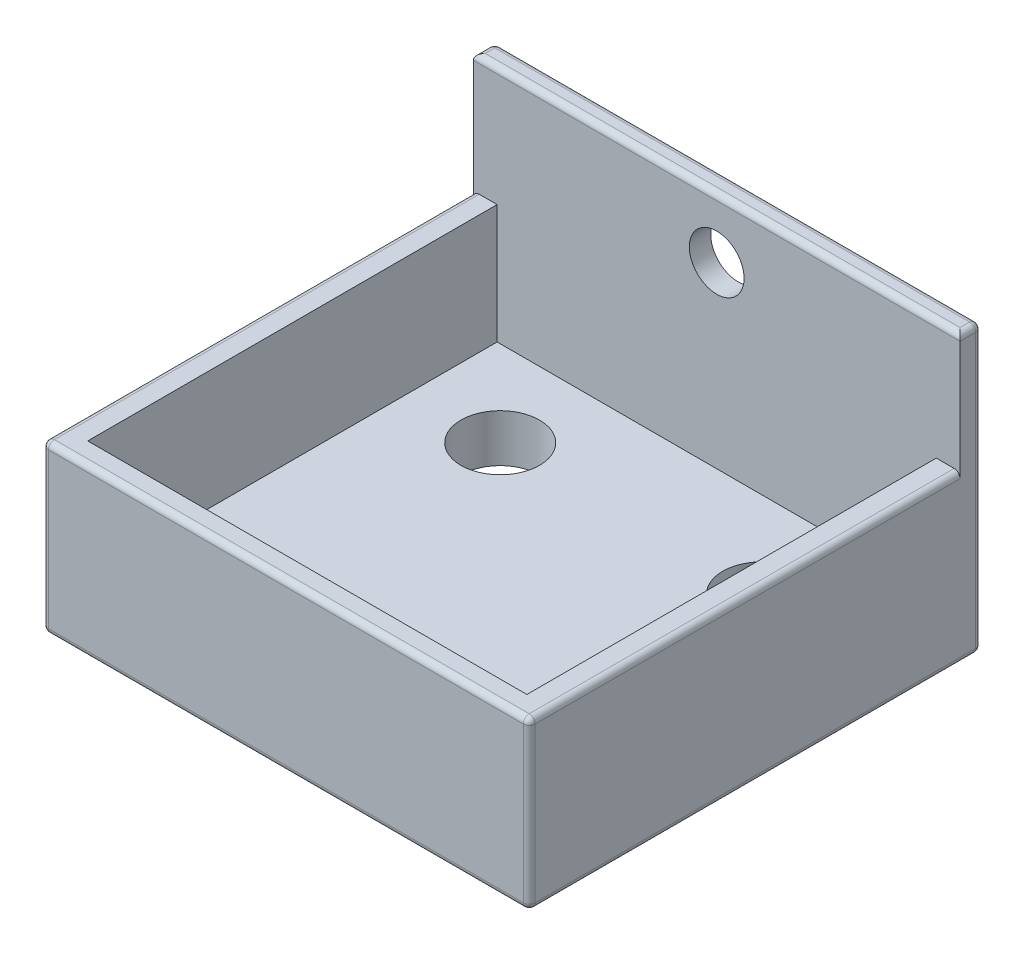
ISO-10303-21;
HEADER;
FILE_DESCRIPTION(('STEP AP214'),'2;1');
FILE_NAME('part.step','',(''),(''),'','','');
FILE_SCHEMA(('AUTOMOTIVE_DESIGN { 1 0 10303 214 1 1 1 1 }'));
ENDSEC;
DATA;
#1=APPLICATION_CONTEXT('core data for automotive mechanical design processes');
#2=APPLICATION_PROTOCOL_DEFINITION('international standard','automotive_design',2000,#1);
#3=PRODUCT_CONTEXT('',#1,'mechanical');
#4=PRODUCT('Part','Part','',(#3));
#5=PRODUCT_RELATED_PRODUCT_CATEGORY('part','',(#4));
#6=PRODUCT_DEFINITION_FORMATION('','',#4);
#7=PRODUCT_DEFINITION_CONTEXT('part definition',#1,'design');
#8=PRODUCT_DEFINITION('design','',#6,#7);
#9=PRODUCT_DEFINITION_SHAPE('','',#8);
#10=(LENGTH_UNIT() NAMED_UNIT(*) SI_UNIT(.MILLI.,.METRE.));
#11=(NAMED_UNIT(*) PLANE_ANGLE_UNIT() SI_UNIT($,.RADIAN.));
#12=(NAMED_UNIT(*) SI_UNIT($,.STERADIAN.) SOLID_ANGLE_UNIT());
#13=UNCERTAINTY_MEASURE_WITH_UNIT(LENGTH_MEASURE(1.E-05),#10,'distance_accuracy_value','');
#14=(GEOMETRIC_REPRESENTATION_CONTEXT(3) GLOBAL_UNCERTAINTY_ASSIGNED_CONTEXT((#13)) GLOBAL_UNIT_ASSIGNED_CONTEXT((#10,
#11,#12)) REPRESENTATION_CONTEXT('',''));
#15=CARTESIAN_POINT('',(0.,0.,0.));
#16=DIRECTION('',(0.,0.,1.));
#17=DIRECTION('',(1.,0.,0.));
#18=AXIS2_PLACEMENT_3D('',#15,#16,#17);
#19=CARTESIAN_POINT('',(0.,0.,0.));
#20=DIRECTION('',(0.,1.,0.));
#21=DIRECTION('',(0.,0.,1.));
#22=AXIS2_PLACEMENT_3D('',#19,#20,#21);
#23=PLANE('',#22);
#24=DIRECTION('',(0.,0.,1.));
#25=VECTOR('',#24,1.);
#26=CARTESIAN_POINT('',(-9.975,0.,0.));
#27=LINE('',#26,#25);
#28=CARTESIAN_POINT('',(-9.975,0.,9.25000000000001));
#29=VERTEX_POINT('',#28);
#30=CARTESIAN_POINT('',(-9.975,0.,-9.24999999999999));
#31=VERTEX_POINT('',#30);
#32=EDGE_CURVE('E337',#29,#31,#27,.F.);
#33=ORIENTED_EDGE('',*,*,#32,.T.);
#34=DIRECTION('',(-1.,0.,0.));
#35=VECTOR('',#34,1.);
#36=CARTESIAN_POINT('',(0.,0.,-9.24999999999999));
#37=LINE('',#36,#35);
#38=CARTESIAN_POINT('',(9.975,0.,-9.24999999999999));
#39=VERTEX_POINT('',#38);
#40=EDGE_CURVE('E339',#31,#39,#37,.F.);
#41=ORIENTED_EDGE('',*,*,#40,.T.);
#42=DIRECTION('',(0.,0.,-1.));
#43=VECTOR('',#42,1.);
#44=CARTESIAN_POINT('',(9.975,0.,0.));
#45=LINE('',#44,#43);
#46=CARTESIAN_POINT('',(9.975,0.,9.25000000000001));
#47=VERTEX_POINT('',#46);
#48=EDGE_CURVE('E333',#39,#47,#45,.F.);
#49=ORIENTED_EDGE('',*,*,#48,.T.);
#50=DIRECTION('',(1.,0.,0.));
#51=VECTOR('',#50,1.);
#52=CARTESIAN_POINT('',(0.,0.,9.25000000000001));
#53=LINE('',#52,#51);
#54=EDGE_CURVE('E335',#47,#29,#53,.F.);
#55=ORIENTED_EDGE('',*,*,#54,.T.);
#56=EDGE_LOOP('',(#33,#41,#49,#55));
#57=FACE_BOUND('',#56,.T.);
#58=CARTESIAN_POINT('',(5.505,0.,-5.));
#59=DIRECTION('',(0.,1.,0.));
#60=DIRECTION('',(0.,0.,1.));
#61=AXIS2_PLACEMENT_3D('',#58,#59,#60);
#62=CIRCLE('',#61,1.65);
#63=CARTESIAN_POINT('',(5.505,0.,-3.35));
#64=VERTEX_POINT('',#63);
#65=EDGE_CURVE('E248',#64,#64,#62,.F.);
#66=ORIENTED_EDGE('',*,*,#65,.F.);
#67=EDGE_LOOP('',(#66));
#68=FACE_BOUND('',#67,.T.);
#69=CARTESIAN_POINT('',(-5.495,0.,-5.));
#70=DIRECTION('',(0.,1.,0.));
#71=DIRECTION('',(0.,0.,1.));
#72=AXIS2_PLACEMENT_3D('',#69,#70,#71);
#73=CIRCLE('',#72,1.65);
#74=CARTESIAN_POINT('',(-5.495,0.,-3.35));
#75=VERTEX_POINT('',#74);
#76=EDGE_CURVE('E243',#75,#75,#73,.F.);
#77=ORIENTED_EDGE('',*,*,#76,.F.);
#78=EDGE_LOOP('',(#77));
#79=FACE_BOUND('',#78,.T.);
#80=DIRECTION('',(0.,0.,-1.));
#81=VECTOR('',#80,1.);
#82=CARTESIAN_POINT('',(8.,0.,4.));
#83=LINE('',#82,#81);
#84=CARTESIAN_POINT('',(8.,0.,6.));
#85=VERTEX_POINT('',#84);
#86=CARTESIAN_POINT('',(8.,0.,4.));
#87=VERTEX_POINT('',#86);
#88=EDGE_CURVE('E210',#85,#87,#83,.T.);
#89=ORIENTED_EDGE('',*,*,#88,.T.);
#90=DIRECTION('',(-1.,0.,0.));
#91=VECTOR('',#90,1.);
#92=CARTESIAN_POINT('',(-8.,0.,4.));
#93=LINE('',#92,#91);
#94=CARTESIAN_POINT('',(-8.,0.,4.));
#95=VERTEX_POINT('',#94);
#96=EDGE_CURVE('E239',#87,#95,#93,.T.);
#97=ORIENTED_EDGE('',*,*,#96,.T.);
#98=DIRECTION('',(0.,0.,-1.));
#99=VECTOR('',#98,1.);
#100=CARTESIAN_POINT('',(-8.,0.,4.));
#101=LINE('',#100,#99);
#102=CARTESIAN_POINT('',(-8.,0.,6.));
#103=VERTEX_POINT('',#102);
#104=EDGE_CURVE('E442',#103,#95,#101,.T.);
#105=ORIENTED_EDGE('',*,*,#104,.F.);
#106=DIRECTION('',(-1.,0.,0.));
#107=VECTOR('',#106,1.);
#108=CARTESIAN_POINT('',(-8.,0.,6.));
#109=LINE('',#108,#107);
#110=EDGE_CURVE('E251',#85,#103,#109,.T.);
#111=ORIENTED_EDGE('',*,*,#110,.F.);
#112=EDGE_LOOP('',(#89,#97,#105,#111));
#113=FACE_BOUND('',#112,.T.);
#114=ADVANCED_FACE('F41',(#57,#68,#79,#113),#23,.F.);
#115=CARTESIAN_POINT('',(0.,2.,0.));
#116=DIRECTION('',(0.,-1.,0.));
#117=DIRECTION('',(0.,0.,-1.));
#118=AXIS2_PLACEMENT_3D('',#115,#116,#117);
#119=PLANE('',#118);
#120=DIRECTION('',(0.,0.,-1.));
#121=VECTOR('',#120,1.);
#122=CARTESIAN_POINT('',(9.225,2.,8.6));
#123=LINE('',#122,#121);
#124=CARTESIAN_POINT('',(9.225,2.,8.6));
#125=VERTEX_POINT('',#124);
#126=CARTESIAN_POINT('',(9.225,2.,-8.6));
#127=VERTEX_POINT('',#126);
#128=EDGE_CURVE('E254',#125,#127,#123,.T.);
#129=ORIENTED_EDGE('',*,*,#128,.T.);
#130=DIRECTION('',(-1.,0.,0.));
#131=VECTOR('',#130,1.);
#132=CARTESIAN_POINT('',(-9.225,2.,-8.6));
#133=LINE('',#132,#131);
#134=CARTESIAN_POINT('',(-9.225,2.,-8.6));
#135=VERTEX_POINT('',#134);
#136=EDGE_CURVE('E257',#127,#135,#133,.T.);
#137=ORIENTED_EDGE('',*,*,#136,.T.);
#138=DIRECTION('',(0.,0.,1.));
#139=VECTOR('',#138,1.);
#140=CARTESIAN_POINT('',(-9.225,2.,8.6));
#141=LINE('',#140,#139);
#142=CARTESIAN_POINT('',(-9.225,2.,8.6));
#143=VERTEX_POINT('',#142);
#144=EDGE_CURVE('E261',#135,#143,#141,.T.);
#145=ORIENTED_EDGE('',*,*,#144,.T.);
#146=DIRECTION('',(1.,0.,0.));
#147=VECTOR('',#146,1.);
#148=CARTESIAN_POINT('',(-9.225,2.,8.6));
#149=LINE('',#148,#147);
#150=EDGE_CURVE('E264',#143,#125,#149,.T.);
#151=ORIENTED_EDGE('',*,*,#150,.T.);
#152=EDGE_LOOP('',(#129,#137,#145,#151));
#153=FACE_BOUND('',#152,.T.);
#154=CARTESIAN_POINT('',(5.505,2.,-5.));
#155=DIRECTION('',(0.,1.,0.));
#156=DIRECTION('',(0.,0.,1.));
#157=AXIS2_PLACEMENT_3D('',#154,#155,#156);
#158=CIRCLE('',#157,1.65);
#159=CARTESIAN_POINT('',(5.505,2.,-3.35));
#160=VERTEX_POINT('',#159);
#161=EDGE_CURVE('E244',#160,#160,#158,.T.);
#162=ORIENTED_EDGE('',*,*,#161,.F.);
#163=EDGE_LOOP('',(#162));
#164=FACE_BOUND('',#163,.T.);
#165=CARTESIAN_POINT('',(-5.495,2.,-5.));
#166=DIRECTION('',(0.,1.,0.));
#167=DIRECTION('',(0.,0.,1.));
#168=AXIS2_PLACEMENT_3D('',#165,#166,#167);
#169=CIRCLE('',#168,1.65);
#170=CARTESIAN_POINT('',(-5.495,2.,-3.35));
#171=VERTEX_POINT('',#170);
#172=EDGE_CURVE('E240',#171,#171,#169,.T.);
#173=ORIENTED_EDGE('',*,*,#172,.F.);
#174=EDGE_LOOP('',(#173));
#175=FACE_BOUND('',#174,.T.);
#176=DIRECTION('',(0.,0.,1.));
#177=VECTOR('',#176,1.);
#178=CARTESIAN_POINT('',(8.,2.,4.));
#179=LINE('',#178,#177);
#180=CARTESIAN_POINT('',(8.,2.,4.));
#181=VERTEX_POINT('',#180);
#182=CARTESIAN_POINT('',(8.,2.,6.));
#183=VERTEX_POINT('',#182);
#184=EDGE_CURVE('E207',#181,#183,#179,.T.);
#185=ORIENTED_EDGE('',*,*,#184,.T.);
#186=DIRECTION('',(1.,0.,0.));
#187=VECTOR('',#186,1.);
#188=CARTESIAN_POINT('',(-8.,2.,6.));
#189=LINE('',#188,#187);
#190=CARTESIAN_POINT('',(-8.,2.,6.));
#191=VERTEX_POINT('',#190);
#192=EDGE_CURVE('E218',#191,#183,#189,.T.);
#193=ORIENTED_EDGE('',*,*,#192,.F.);
#194=DIRECTION('',(0.,0.,1.));
#195=VECTOR('',#194,1.);
#196=CARTESIAN_POINT('',(-8.,2.,4.));
#197=LINE('',#196,#195);
#198=CARTESIAN_POINT('',(-8.,2.,4.));
#199=VERTEX_POINT('',#198);
#200=EDGE_CURVE('E214',#199,#191,#197,.T.);
#201=ORIENTED_EDGE('',*,*,#200,.F.);
#202=DIRECTION('',(1.,0.,0.));
#203=VECTOR('',#202,1.);
#204=CARTESIAN_POINT('',(-8.,2.,4.));
#205=LINE('',#204,#203);
#206=EDGE_CURVE('E228',#199,#181,#205,.T.);
#207=ORIENTED_EDGE('',*,*,#206,.T.);
#208=EDGE_LOOP('',(#185,#193,#201,#207));
#209=FACE_BOUND('',#208,.T.);
#210=ADVANCED_FACE('F226',(#153,#164,#175,#209),#119,.F.);
#211=CARTESIAN_POINT('',(-10.225,7.,9.50000000000001));
#212=DIRECTION('',(1.,0.,0.));
#213=DIRECTION('',(0.,0.,-1.));
#214=AXIS2_PLACEMENT_3D('',#211,#212,#213);
#215=PLANE('',#214);
#216=DIRECTION('',(0.,0.,1.));
#217=VECTOR('',#216,1.);
#218=CARTESIAN_POINT('',(-10.225,6.75,-8.59999999999999));
#219=LINE('',#218,#217);
#220=CARTESIAN_POINT('',(-10.225,6.75,9.25000000000001));
#221=VERTEX_POINT('',#220);
#222=CARTESIAN_POINT('',(-10.225,6.75,-8.59999999999999));
#223=VERTEX_POINT('',#222);
#224=EDGE_CURVE('E296',#221,#223,#219,.F.);
#225=ORIENTED_EDGE('',*,*,#224,.T.);
#226=DIRECTION('',(0.,-1.,0.));
#227=VECTOR('',#226,1.);
#228=CARTESIAN_POINT('',(-10.225,12.,-8.59999999999999));
#229=LINE('',#228,#227);
#230=CARTESIAN_POINT('',(-10.225,11.75,-8.59999999999999));
#231=VERTEX_POINT('',#230);
#232=EDGE_CURVE('E224',#231,#223,#229,.T.);
#233=ORIENTED_EDGE('',*,*,#232,.F.);
#234=DIRECTION('',(0.,0.,1.));
#235=VECTOR('',#234,1.);
#236=CARTESIAN_POINT('',(-10.225,11.75,-9.49999999999999));
#237=LINE('',#236,#235);
#238=CARTESIAN_POINT('',(-10.225,11.75,-9.24999999999999));
#239=VERTEX_POINT('',#238);
#240=EDGE_CURVE('E303',#231,#239,#237,.F.);
#241=ORIENTED_EDGE('',*,*,#240,.T.);
#242=DIRECTION('',(0.,-1.,0.));
#243=VECTOR('',#242,1.);
#244=CARTESIAN_POINT('',(-10.225,7.,-9.24999999999999));
#245=LINE('',#244,#243);
#246=CARTESIAN_POINT('',(-10.225,0.25,-9.24999999999999));
#247=VERTEX_POINT('',#246);
#248=EDGE_CURVE('E301',#239,#247,#245,.T.);
#249=ORIENTED_EDGE('',*,*,#248,.T.);
#250=DIRECTION('',(0.,0.,1.));
#251=VECTOR('',#250,1.);
#252=CARTESIAN_POINT('',(-10.225,0.25,9.50000000000001));
#253=LINE('',#252,#251);
#254=CARTESIAN_POINT('',(-10.225,0.25,9.25000000000001));
#255=VERTEX_POINT('',#254);
#256=EDGE_CURVE('E299',#247,#255,#253,.T.);
#257=ORIENTED_EDGE('',*,*,#256,.T.);
#258=DIRECTION('',(0.,-1.,0.));
#259=VECTOR('',#258,1.);
#260=CARTESIAN_POINT('',(-10.225,7.,9.25000000000001));
#261=LINE('',#260,#259);
#262=EDGE_CURVE('E294',#255,#221,#261,.F.);
#263=ORIENTED_EDGE('',*,*,#262,.T.);
#264=EDGE_LOOP('',(#225,#233,#241,#249,#257,#263));
#265=FACE_BOUND('',#264,.T.);
#266=ADVANCED_FACE('F467',(#265),#215,.F.);
#267=CARTESIAN_POINT('',(10.225,7.,9.50000000000001));
#268=DIRECTION('',(0.,0.,-1.));
#269=DIRECTION('',(-1.,0.,0.));
#270=AXIS2_PLACEMENT_3D('',#267,#268,#269);
#271=PLANE('',#270);
#272=DIRECTION('',(1.,0.,0.));
#273=VECTOR('',#272,1.);
#274=CARTESIAN_POINT('',(10.225,0.25,9.50000000000001));
#275=LINE('',#274,#273);
#276=CARTESIAN_POINT('',(-9.975,0.25,9.50000000000001));
#277=VERTEX_POINT('',#276);
#278=CARTESIAN_POINT('',(9.975,0.25,9.50000000000001));
#279=VERTEX_POINT('',#278);
#280=EDGE_CURVE('E63',#277,#279,#275,.T.);
#281=ORIENTED_EDGE('',*,*,#280,.T.);
#282=DIRECTION('',(0.,-1.,0.));
#283=VECTOR('',#282,1.);
#284=CARTESIAN_POINT('',(9.975,7.,9.50000000000001));
#285=LINE('',#284,#283);
#286=CARTESIAN_POINT('',(9.975,6.75,9.50000000000001));
#287=VERTEX_POINT('',#286);
#288=EDGE_CURVE('E58',#279,#287,#285,.F.);
#289=ORIENTED_EDGE('',*,*,#288,.T.);
#290=DIRECTION('',(1.,0.,0.));
#291=VECTOR('',#290,1.);
#292=CARTESIAN_POINT('',(-10.225,6.75,9.50000000000001));
#293=LINE('',#292,#291);
#294=CARTESIAN_POINT('',(-9.975,6.75,9.50000000000001));
#295=VERTEX_POINT('',#294);
#296=EDGE_CURVE('E345',#287,#295,#293,.F.);
#297=ORIENTED_EDGE('',*,*,#296,.T.);
#298=DIRECTION('',(0.,-1.,0.));
#299=VECTOR('',#298,1.);
#300=CARTESIAN_POINT('',(-9.975,7.,9.50000000000001));
#301=LINE('',#300,#299);
#302=EDGE_CURVE('E342',#295,#277,#301,.T.);
#303=ORIENTED_EDGE('',*,*,#302,.T.);
#304=EDGE_LOOP('',(#281,#289,#297,#303));
#305=FACE_BOUND('',#304,.T.);
#306=ADVANCED_FACE('F482',(#305),#271,.F.);
#307=CARTESIAN_POINT('',(10.225,7.,9.50000000000001));
#308=DIRECTION('',(-1.,0.,0.));
#309=DIRECTION('',(0.,0.,1.));
#310=AXIS2_PLACEMENT_3D('',#307,#308,#309);
#311=PLANE('',#310);
#312=DIRECTION('',(0.,-1.,0.));
#313=VECTOR('',#312,1.);
#314=CARTESIAN_POINT('',(10.225,7.,-9.24999999999999));
#315=LINE('',#314,#313);
#316=CARTESIAN_POINT('',(10.225,0.25,-9.24999999999999));
#317=VERTEX_POINT('',#316);
#318=CARTESIAN_POINT('',(10.225,11.75,-9.24999999999999));
#319=VERTEX_POINT('',#318);
#320=EDGE_CURVE('E312',#317,#319,#315,.F.);
#321=ORIENTED_EDGE('',*,*,#320,.T.);
#322=DIRECTION('',(0.,0.,-1.));
#323=VECTOR('',#322,1.);
#324=CARTESIAN_POINT('',(10.225,11.75,-8.59999999999999));
#325=LINE('',#324,#323);
#326=CARTESIAN_POINT('',(10.225,11.75,-8.59999999999999));
#327=VERTEX_POINT('',#326);
#328=EDGE_CURVE('E314',#319,#327,#325,.F.);
#329=ORIENTED_EDGE('',*,*,#328,.T.);
#330=DIRECTION('',(0.,-1.,0.));
#331=VECTOR('',#330,1.);
#332=CARTESIAN_POINT('',(10.225,12.,-8.59999999999999));
#333=LINE('',#332,#331);
#334=CARTESIAN_POINT('',(10.225,6.75,-8.59999999999999));
#335=VERTEX_POINT('',#334);
#336=EDGE_CURVE('E437',#327,#335,#333,.T.);
#337=ORIENTED_EDGE('',*,*,#336,.T.);
#338=DIRECTION('',(0.,0.,-1.));
#339=VECTOR('',#338,1.);
#340=CARTESIAN_POINT('',(10.225,6.75,9.50000000000001));
#341=LINE('',#340,#339);
#342=CARTESIAN_POINT('',(10.225,6.75,9.25000000000001));
#343=VERTEX_POINT('',#342);
#344=EDGE_CURVE('E310',#335,#343,#341,.F.);
#345=ORIENTED_EDGE('',*,*,#344,.T.);
#346=DIRECTION('',(0.,-1.,0.));
#347=VECTOR('',#346,1.);
#348=CARTESIAN_POINT('',(10.225,7.,9.25000000000001));
#349=LINE('',#348,#347);
#350=CARTESIAN_POINT('',(10.225,0.25,9.25000000000001));
#351=VERTEX_POINT('',#350);
#352=EDGE_CURVE('E306',#343,#351,#349,.T.);
#353=ORIENTED_EDGE('',*,*,#352,.T.);
#354=DIRECTION('',(0.,0.,-1.));
#355=VECTOR('',#354,1.);
#356=CARTESIAN_POINT('',(10.225,0.25,9.50000000000001));
#357=LINE('',#356,#355);
#358=EDGE_CURVE('E308',#351,#317,#357,.T.);
#359=ORIENTED_EDGE('',*,*,#358,.T.);
#360=EDGE_LOOP('',(#321,#329,#337,#345,#353,#359));
#361=FACE_BOUND('',#360,.T.);
#362=ADVANCED_FACE('F478',(#361),#311,.F.);
#363=CARTESIAN_POINT('',(10.225,7.,-9.49999999999999));
#364=DIRECTION('',(0.,0.,1.));
#365=DIRECTION('',(1.,0.,0.));
#366=AXIS2_PLACEMENT_3D('',#363,#364,#365);
#367=PLANE('',#366);
#368=DIRECTION('',(-1.,0.,0.));
#369=VECTOR('',#368,1.);
#370=CARTESIAN_POINT('',(10.225,0.25,-9.49999999999999));
#371=LINE('',#370,#369);
#372=CARTESIAN_POINT('',(9.975,0.25,-9.49999999999999));
#373=VERTEX_POINT('',#372);
#374=CARTESIAN_POINT('',(-9.975,0.25,-9.49999999999999));
#375=VERTEX_POINT('',#374);
#376=EDGE_CURVE('E318',#373,#375,#371,.T.);
#377=ORIENTED_EDGE('',*,*,#376,.T.);
#378=DIRECTION('',(0.,-1.,0.));
#379=VECTOR('',#378,1.);
#380=CARTESIAN_POINT('',(-9.975,7.,-9.49999999999999));
#381=LINE('',#380,#379);
#382=CARTESIAN_POINT('',(-9.975,11.75,-9.49999999999999));
#383=VERTEX_POINT('',#382);
#384=EDGE_CURVE('E323',#375,#383,#381,.F.);
#385=ORIENTED_EDGE('',*,*,#384,.T.);
#386=DIRECTION('',(-1.,0.,0.));
#387=VECTOR('',#386,1.);
#388=CARTESIAN_POINT('',(10.225,11.75,-9.49999999999999));
#389=LINE('',#388,#387);
#390=CARTESIAN_POINT('',(9.975,11.75,-9.49999999999999));
#391=VERTEX_POINT('',#390);
#392=EDGE_CURVE('E320',#383,#391,#389,.F.);
#393=ORIENTED_EDGE('',*,*,#392,.T.);
#394=DIRECTION('',(0.,-1.,0.));
#395=VECTOR('',#394,1.);
#396=CARTESIAN_POINT('',(9.975,7.,-9.49999999999999));
#397=LINE('',#396,#395);
#398=EDGE_CURVE('E316',#391,#373,#397,.T.);
#399=ORIENTED_EDGE('',*,*,#398,.T.);
#400=EDGE_LOOP('',(#377,#385,#393,#399));
#401=FACE_BOUND('',#400,.T.);
#402=CARTESIAN_POINT('',(0.,9.5,-9.49999999999999));
#403=DIRECTION('',(0.,0.,1.));
#404=DIRECTION('',(1.,0.,0.));
#405=AXIS2_PLACEMENT_3D('',#402,#403,#404);
#406=CIRCLE('',#405,1.15);
#407=CARTESIAN_POINT('',(1.15,9.5,-9.49999999999999));
#408=VERTEX_POINT('',#407);
#409=EDGE_CURVE('E428',#408,#408,#406,.F.);
#410=ORIENTED_EDGE('',*,*,#409,.F.);
#411=EDGE_LOOP('',(#410));
#412=FACE_BOUND('',#411,.T.);
#413=ADVANCED_FACE('F475',(#401,#412),#367,.F.);
#414=CARTESIAN_POINT('',(0.,7.,0.));
#415=DIRECTION('',(0.,1.,0.));
#416=DIRECTION('',(0.,0.,1.));
#417=AXIS2_PLACEMENT_3D('',#414,#415,#416);
#418=PLANE('',#417);
#419=DIRECTION('',(1.,0.,0.));
#420=VECTOR('',#419,1.);
#421=CARTESIAN_POINT('',(10.225,7.,9.25000000000001));
#422=LINE('',#421,#420);
#423=CARTESIAN_POINT('',(-9.975,7.,9.25000000000001));
#424=VERTEX_POINT('',#423);
#425=CARTESIAN_POINT('',(9.975,7.,9.25000000000001));
#426=VERTEX_POINT('',#425);
#427=EDGE_CURVE('E327',#424,#426,#422,.T.);
#428=ORIENTED_EDGE('',*,*,#427,.T.);
#429=DIRECTION('',(0.,0.,-1.));
#430=VECTOR('',#429,1.);
#431=CARTESIAN_POINT('',(9.975,7.,-8.59999999999999));
#432=LINE('',#431,#430);
#433=CARTESIAN_POINT('',(9.975,7.,-8.59999999999999));
#434=VERTEX_POINT('',#433);
#435=EDGE_CURVE('E331',#426,#434,#432,.T.);
#436=ORIENTED_EDGE('',*,*,#435,.T.);
#437=DIRECTION('',(1.,0.,0.));
#438=VECTOR('',#437,1.);
#439=CARTESIAN_POINT('',(-10.225,7.,-8.59999999999999));
#440=LINE('',#439,#438);
#441=CARTESIAN_POINT('',(9.225,7.,-8.6));
#442=VERTEX_POINT('',#441);
#443=EDGE_CURVE('E277',#442,#434,#440,.T.);
#444=ORIENTED_EDGE('',*,*,#443,.F.);
#445=DIRECTION('',(0.,0.,-1.));
#446=VECTOR('',#445,1.);
#447=CARTESIAN_POINT('',(9.225,7.,8.6));
#448=LINE('',#447,#446);
#449=CARTESIAN_POINT('',(9.225,7.,8.6));
#450=VERTEX_POINT('',#449);
#451=EDGE_CURVE('E247',#450,#442,#448,.T.);
#452=ORIENTED_EDGE('',*,*,#451,.F.);
#453=DIRECTION('',(1.,0.,0.));
#454=VECTOR('',#453,1.);
#455=CARTESIAN_POINT('',(-9.225,7.,8.6));
#456=LINE('',#455,#454);
#457=CARTESIAN_POINT('',(-9.225,7.,8.6));
#458=VERTEX_POINT('',#457);
#459=EDGE_CURVE('E258',#458,#450,#456,.T.);
#460=ORIENTED_EDGE('',*,*,#459,.F.);
#461=DIRECTION('',(0.,0.,1.));
#462=VECTOR('',#461,1.);
#463=CARTESIAN_POINT('',(-9.225,7.,8.6));
#464=LINE('',#463,#462);
#465=CARTESIAN_POINT('',(-9.225,7.,-8.6));
#466=VERTEX_POINT('',#465);
#467=EDGE_CURVE('E270',#466,#458,#464,.T.);
#468=ORIENTED_EDGE('',*,*,#467,.F.);
#469=CARTESIAN_POINT('',(-9.975,7.,-8.59999999999999));
#470=VERTEX_POINT('',#469);
#471=EDGE_CURVE('E433',#470,#466,#440,.T.);
#472=ORIENTED_EDGE('',*,*,#471,.F.);
#473=DIRECTION('',(0.,0.,1.));
#474=VECTOR('',#473,1.);
#475=CARTESIAN_POINT('',(-9.975,7.,9.50000000000001));
#476=LINE('',#475,#474);
#477=EDGE_CURVE('E329',#470,#424,#476,.T.);
#478=ORIENTED_EDGE('',*,*,#477,.T.);
#479=EDGE_LOOP('',(#428,#436,#444,#452,#460,#468,#472,#478));
#480=FACE_BOUND('',#479,.T.);
#481=ADVANCED_FACE('F473',(#480),#418,.T.);
#482=CARTESIAN_POINT('',(9.225,2.,8.6));
#483=DIRECTION('',(1.,0.,0.));
#484=DIRECTION('',(0.,0.,-1.));
#485=AXIS2_PLACEMENT_3D('',#482,#483,#484);
#486=PLANE('',#485);
#487=ORIENTED_EDGE('',*,*,#451,.T.);
#488=DIRECTION('',(0.,1.,0.));
#489=VECTOR('',#488,1.);
#490=CARTESIAN_POINT('',(9.225,2.,-8.6));
#491=LINE('',#490,#489);
#492=EDGE_CURVE('E267',#127,#442,#491,.T.);
#493=ORIENTED_EDGE('',*,*,#492,.F.);
#494=ORIENTED_EDGE('',*,*,#128,.F.);
#495=DIRECTION('',(0.,1.,0.));
#496=VECTOR('',#495,1.);
#497=CARTESIAN_POINT('',(9.225,2.,8.6));
#498=LINE('',#497,#496);
#499=EDGE_CURVE('E275',#125,#450,#498,.T.);
#500=ORIENTED_EDGE('',*,*,#499,.T.);
#501=EDGE_LOOP('',(#487,#493,#494,#500));
#502=FACE_BOUND('',#501,.T.);
#503=ADVANCED_FACE('F594',(#502),#486,.F.);
#504=CARTESIAN_POINT('',(-9.225,2.,8.6));
#505=DIRECTION('',(0.,0.,1.));
#506=DIRECTION('',(1.,0.,0.));
#507=AXIS2_PLACEMENT_3D('',#504,#505,#506);
#508=PLANE('',#507);
#509=ORIENTED_EDGE('',*,*,#459,.T.);
#510=ORIENTED_EDGE('',*,*,#499,.F.);
#511=ORIENTED_EDGE('',*,*,#150,.F.);
#512=DIRECTION('',(0.,1.,0.));
#513=VECTOR('',#512,1.);
#514=CARTESIAN_POINT('',(-9.225,2.,8.6));
#515=LINE('',#514,#513);
#516=EDGE_CURVE('E278',#143,#458,#515,.T.);
#517=ORIENTED_EDGE('',*,*,#516,.T.);
#518=EDGE_LOOP('',(#509,#510,#511,#517));
#519=FACE_BOUND('',#518,.T.);
#520=ADVANCED_FACE('F599',(#519),#508,.F.);
#521=CARTESIAN_POINT('',(-9.225,2.,8.6));
#522=DIRECTION('',(-1.,0.,0.));
#523=DIRECTION('',(0.,0.,1.));
#524=AXIS2_PLACEMENT_3D('',#521,#522,#523);
#525=PLANE('',#524);
#526=ORIENTED_EDGE('',*,*,#467,.T.);
#527=ORIENTED_EDGE('',*,*,#516,.F.);
#528=ORIENTED_EDGE('',*,*,#144,.F.);
#529=DIRECTION('',(0.,1.,0.));
#530=VECTOR('',#529,1.);
#531=CARTESIAN_POINT('',(-9.225,2.,-8.6));
#532=LINE('',#531,#530);
#533=EDGE_CURVE('E280',#135,#466,#532,.T.);
#534=ORIENTED_EDGE('',*,*,#533,.T.);
#535=EDGE_LOOP('',(#526,#527,#528,#534));
#536=FACE_BOUND('',#535,.T.);
#537=ADVANCED_FACE('F603',(#536),#525,.F.);
#538=CARTESIAN_POINT('',(-9.225,2.,-8.6));
#539=DIRECTION('',(0.,0.,-1.));
#540=DIRECTION('',(-1.,0.,0.));
#541=AXIS2_PLACEMENT_3D('',#538,#539,#540);
#542=PLANE('',#541);
#543=CARTESIAN_POINT('',(0.,9.5,-8.6));
#544=DIRECTION('',(0.,0.,1.));
#545=DIRECTION('',(1.,0.,0.));
#546=AXIS2_PLACEMENT_3D('',#543,#544,#545);
#547=CIRCLE('',#546,1.15);
#548=CARTESIAN_POINT('',(1.15,9.5,-8.6));
#549=VERTEX_POINT('',#548);
#550=EDGE_CURVE('E423',#549,#549,#547,.T.);
#551=ORIENTED_EDGE('',*,*,#550,.F.);
#552=EDGE_LOOP('',(#551));
#553=FACE_BOUND('',#552,.T.);
#554=ORIENTED_EDGE('',*,*,#336,.F.);
#555=DIRECTION('',(1.,0.,0.));
#556=VECTOR('',#555,1.);
#557=CARTESIAN_POINT('',(-10.225,11.75,-8.6));
#558=LINE('',#557,#556);
#559=EDGE_CURVE('E325',#327,#231,#558,.F.);
#560=ORIENTED_EDGE('',*,*,#559,.T.);
#561=ORIENTED_EDGE('',*,*,#232,.T.);
#562=CARTESIAN_POINT('',(-9.975,6.75,-8.6));
#563=DIRECTION('',(0.,0.,-1.));
#564=DIRECTION('',(-1.,0.,0.));
#565=AXIS2_PLACEMENT_3D('',#562,#563,#564);
#566=CIRCLE('',#565,0.25);
#567=EDGE_CURVE('E11',#223,#470,#566,.T.);
#568=ORIENTED_EDGE('',*,*,#567,.T.);
#569=ORIENTED_EDGE('',*,*,#471,.T.);
#570=ORIENTED_EDGE('',*,*,#533,.F.);
#571=ORIENTED_EDGE('',*,*,#136,.F.);
#572=ORIENTED_EDGE('',*,*,#492,.T.);
#573=ORIENTED_EDGE('',*,*,#443,.T.);
#574=CARTESIAN_POINT('',(9.975,6.75,-8.6));
#575=DIRECTION('',(0.,0.,-1.));
#576=DIRECTION('',(-1.,0.,0.));
#577=AXIS2_PLACEMENT_3D('',#574,#575,#576);
#578=CIRCLE('',#577,0.25);
#579=EDGE_CURVE('E50',#434,#335,#578,.T.);
#580=ORIENTED_EDGE('',*,*,#579,.T.);
#581=EDGE_LOOP('',(#554,#560,#561,#568,#569,#570,#571,#572,#573,#580));
#582=FACE_BOUND('',#581,.T.);
#583=ADVANCED_FACE('F590',(#553,#582),#542,.F.);
#584=CARTESIAN_POINT('',(5.505,-4.66690475583122,-5.));
#585=DIRECTION('',(0.,1.,0.));
#586=DIRECTION('',(0.,0.,1.));
#587=AXIS2_PLACEMENT_3D('',#584,#585,#586);
#588=CYLINDRICAL_SURFACE('',#587,1.65);
#589=ORIENTED_EDGE('',*,*,#65,.T.);
#590=EDGE_LOOP('',(#589));
#591=FACE_BOUND('',#590,.T.);
#592=ORIENTED_EDGE('',*,*,#161,.T.);
#593=EDGE_LOOP('',(#592));
#594=FACE_BOUND('',#593,.T.);
#595=ADVANCED_FACE('F665',(#591,#594),#588,.F.);
#596=CARTESIAN_POINT('',(-5.495,-4.66690475583122,-5.));
#597=DIRECTION('',(0.,1.,0.));
#598=DIRECTION('',(0.,0.,1.));
#599=AXIS2_PLACEMENT_3D('',#596,#597,#598);
#600=CYLINDRICAL_SURFACE('',#599,1.65);
#601=ORIENTED_EDGE('',*,*,#76,.T.);
#602=EDGE_LOOP('',(#601));
#603=FACE_BOUND('',#602,.T.);
#604=ORIENTED_EDGE('',*,*,#172,.T.);
#605=EDGE_LOOP('',(#604));
#606=FACE_BOUND('',#605,.T.);
#607=ADVANCED_FACE('F457',(#603,#606),#600,.F.);
#608=CARTESIAN_POINT('',(8.,-16.1245154965971,4.));
#609=DIRECTION('',(-1.,0.,0.));
#610=DIRECTION('',(0.,0.,1.));
#611=AXIS2_PLACEMENT_3D('',#608,#609,#610);
#612=PLANE('',#611);
#613=DIRECTION('',(0.,1.,0.));
#614=VECTOR('',#613,1.);
#615=CARTESIAN_POINT('',(8.,-16.1245154965971,6.));
#616=LINE('',#615,#614);
#617=EDGE_CURVE('E202',#85,#183,#616,.T.);
#618=ORIENTED_EDGE('',*,*,#617,.T.);
#619=ORIENTED_EDGE('',*,*,#184,.F.);
#620=DIRECTION('',(0.,1.,0.));
#621=VECTOR('',#620,1.);
#622=CARTESIAN_POINT('',(8.,-16.1245154965971,4.));
#623=LINE('',#622,#621);
#624=EDGE_CURVE('E213',#87,#181,#623,.T.);
#625=ORIENTED_EDGE('',*,*,#624,.F.);
#626=ORIENTED_EDGE('',*,*,#88,.F.);
#627=EDGE_LOOP('',(#618,#619,#625,#626));
#628=FACE_BOUND('',#627,.T.);
#629=ADVANCED_FACE('F204',(#628),#612,.T.);
#630=CARTESIAN_POINT('',(-8.,-16.1245154965971,4.));
#631=DIRECTION('',(0.,0.,1.));
#632=DIRECTION('',(1.,0.,0.));
#633=AXIS2_PLACEMENT_3D('',#630,#631,#632);
#634=PLANE('',#633);
#635=ORIENTED_EDGE('',*,*,#624,.T.);
#636=ORIENTED_EDGE('',*,*,#206,.F.);
#637=DIRECTION('',(0.,1.,0.));
#638=VECTOR('',#637,1.);
#639=CARTESIAN_POINT('',(-8.,-16.1245154965971,4.));
#640=LINE('',#639,#638);
#641=EDGE_CURVE('E235',#95,#199,#640,.T.);
#642=ORIENTED_EDGE('',*,*,#641,.F.);
#643=ORIENTED_EDGE('',*,*,#96,.F.);
#644=EDGE_LOOP('',(#635,#636,#642,#643));
#645=FACE_BOUND('',#644,.T.);
#646=ADVANCED_FACE('F449',(#645),#634,.T.);
#647=CARTESIAN_POINT('',(-8.,-16.1245154965971,4.));
#648=DIRECTION('',(-1.,0.,0.));
#649=DIRECTION('',(0.,0.,1.));
#650=AXIS2_PLACEMENT_3D('',#647,#648,#649);
#651=PLANE('',#650);
#652=ORIENTED_EDGE('',*,*,#104,.T.);
#653=ORIENTED_EDGE('',*,*,#641,.T.);
#654=ORIENTED_EDGE('',*,*,#200,.T.);
#655=DIRECTION('',(0.,1.,0.));
#656=VECTOR('',#655,1.);
#657=CARTESIAN_POINT('',(-8.,-16.1245154965971,6.));
#658=LINE('',#657,#656);
#659=EDGE_CURVE('E221',#103,#191,#658,.T.);
#660=ORIENTED_EDGE('',*,*,#659,.F.);
#661=EDGE_LOOP('',(#652,#653,#654,#660));
#662=FACE_BOUND('',#661,.T.);
#663=ADVANCED_FACE('F446',(#662),#651,.F.);
#664=CARTESIAN_POINT('',(-8.,-16.1245154965971,6.));
#665=DIRECTION('',(0.,0.,1.));
#666=DIRECTION('',(1.,0.,0.));
#667=AXIS2_PLACEMENT_3D('',#664,#665,#666);
#668=PLANE('',#667);
#669=ORIENTED_EDGE('',*,*,#110,.T.);
#670=ORIENTED_EDGE('',*,*,#659,.T.);
#671=ORIENTED_EDGE('',*,*,#192,.T.);
#672=ORIENTED_EDGE('',*,*,#617,.F.);
#673=EDGE_LOOP('',(#669,#670,#671,#672));
#674=FACE_BOUND('',#673,.T.);
#675=ADVANCED_FACE('F219',(#674),#668,.F.);
#676=CARTESIAN_POINT('',(0.,12.,0.));
#677=DIRECTION('',(0.,1.,0.));
#678=DIRECTION('',(0.,0.,1.));
#679=AXIS2_PLACEMENT_3D('',#676,#677,#678);
#680=PLANE('',#679);
#681=DIRECTION('',(0.,0.,-1.));
#682=VECTOR('',#681,1.);
#683=CARTESIAN_POINT('',(9.975,12.,-9.49999999999999));
#684=LINE('',#683,#682);
#685=CARTESIAN_POINT('',(9.975,12.,-8.85));
#686=VERTEX_POINT('',#685);
#687=CARTESIAN_POINT('',(9.975,12.,-9.24999999999999));
#688=VERTEX_POINT('',#687);
#689=EDGE_CURVE('E287',#686,#688,#684,.T.);
#690=ORIENTED_EDGE('',*,*,#689,.T.);
#691=DIRECTION('',(-1.,0.,0.));
#692=VECTOR('',#691,1.);
#693=CARTESIAN_POINT('',(-10.225,12.,-9.24999999999999));
#694=LINE('',#693,#692);
#695=CARTESIAN_POINT('',(-9.975,12.,-9.24999999999999));
#696=VERTEX_POINT('',#695);
#697=EDGE_CURVE('E292',#688,#696,#694,.T.);
#698=ORIENTED_EDGE('',*,*,#697,.T.);
#699=DIRECTION('',(0.,0.,1.));
#700=VECTOR('',#699,1.);
#701=CARTESIAN_POINT('',(-9.975,12.,-8.59999999999999));
#702=LINE('',#701,#700);
#703=CARTESIAN_POINT('',(-9.975,12.,-8.85));
#704=VERTEX_POINT('',#703);
#705=EDGE_CURVE('E289',#696,#704,#702,.T.);
#706=ORIENTED_EDGE('',*,*,#705,.T.);
#707=DIRECTION('',(1.,0.,0.));
#708=VECTOR('',#707,1.);
#709=CARTESIAN_POINT('',(10.225,12.,-8.85));
#710=LINE('',#709,#708);
#711=EDGE_CURVE('E285',#704,#686,#710,.T.);
#712=ORIENTED_EDGE('',*,*,#711,.T.);
#713=EDGE_LOOP('',(#690,#698,#706,#712));
#714=FACE_BOUND('',#713,.T.);
#715=ADVANCED_FACE('F649',(#714),#680,.T.);
#716=CARTESIAN_POINT('',(0.,9.5,-12.7526911934581));
#717=DIRECTION('',(0.,0.,1.));
#718=DIRECTION('',(1.,0.,0.));
#719=AXIS2_PLACEMENT_3D('',#716,#717,#718);
#720=CYLINDRICAL_SURFACE('',#719,1.15);
#721=ORIENTED_EDGE('',*,*,#409,.T.);
#722=EDGE_LOOP('',(#721));
#723=FACE_BOUND('',#722,.T.);
#724=ORIENTED_EDGE('',*,*,#550,.T.);
#725=EDGE_LOOP('',(#724));
#726=FACE_BOUND('',#725,.T.);
#727=ADVANCED_FACE('F575',(#723,#726),#720,.F.);
#728=CARTESIAN_POINT('',(9.975,6.75,0.));
#729=DIRECTION('',(0.,0.,1.));
#730=DIRECTION('',(1.,0.,0.));
#731=AXIS2_PLACEMENT_3D('',#728,#729,#730);
#732=CYLINDRICAL_SURFACE('',#731,0.25);
#733=CARTESIAN_POINT('',(9.975,6.75,9.25000000000001));
#734=DIRECTION('',(0.,0.,1.));
#735=DIRECTION('',(1.,0.,0.));
#736=AXIS2_PLACEMENT_3D('',#733,#734,#735);
#737=CIRCLE('',#736,0.25);
#738=EDGE_CURVE('E45',#343,#426,#737,.T.);
#739=ORIENTED_EDGE('',*,*,#738,.F.);
#740=ORIENTED_EDGE('',*,*,#344,.F.);
#741=ORIENTED_EDGE('',*,*,#579,.F.);
#742=ORIENTED_EDGE('',*,*,#435,.F.);
#743=EDGE_LOOP('',(#739,#740,#741,#742));
#744=FACE_BOUND('',#743,.T.);
#745=ADVANCED_FACE('F43',(#744),#732,.T.);
#746=CARTESIAN_POINT('',(9.975,6.75,9.25000000000001));
#747=DIRECTION('',(0.,1.,0.));
#748=DIRECTION('',(0.,0.,1.));
#749=AXIS2_PLACEMENT_3D('',#746,#747,#748);
#750=SPHERICAL_SURFACE('',#749,0.25);
#751=CARTESIAN_POINT('',(9.975,6.75,9.25000000000001));
#752=DIRECTION('',(0.,1.,0.));
#753=DIRECTION('',(0.,0.,1.));
#754=AXIS2_PLACEMENT_3D('',#751,#752,#753);
#755=CIRCLE('',#754,0.25);
#756=EDGE_CURVE('E415',#343,#287,#755,.F.);
#757=ORIENTED_EDGE('',*,*,#756,.F.);
#758=ORIENTED_EDGE('',*,*,#738,.T.);
#759=CARTESIAN_POINT('',(9.975,6.75,9.25000000000001));
#760=DIRECTION('',(1.,0.,0.));
#761=DIRECTION('',(0.,0.,-1.));
#762=AXIS2_PLACEMENT_3D('',#759,#760,#761);
#763=CIRCLE('',#762,0.25);
#764=EDGE_CURVE('E416',#287,#426,#763,.F.);
#765=ORIENTED_EDGE('',*,*,#764,.F.);
#766=EDGE_LOOP('',(#757,#758,#765));
#767=FACE_BOUND('',#766,.T.);
#768=ADVANCED_FACE('F569',(#767),#750,.T.);
#769=CARTESIAN_POINT('',(-9.975,6.75,0.));
#770=DIRECTION('',(0.,0.,-1.));
#771=DIRECTION('',(-1.,0.,0.));
#772=AXIS2_PLACEMENT_3D('',#769,#770,#771);
#773=CYLINDRICAL_SURFACE('',#772,0.25);
#774=ORIENTED_EDGE('',*,*,#567,.F.);
#775=ORIENTED_EDGE('',*,*,#224,.F.);
#776=CARTESIAN_POINT('',(-9.975,6.75,9.25000000000001));
#777=DIRECTION('',(0.,0.,1.));
#778=DIRECTION('',(1.,0.,0.));
#779=AXIS2_PLACEMENT_3D('',#776,#777,#778);
#780=CIRCLE('',#779,0.25);
#781=EDGE_CURVE('E412',#424,#221,#780,.T.);
#782=ORIENTED_EDGE('',*,*,#781,.F.);
#783=ORIENTED_EDGE('',*,*,#477,.F.);
#784=EDGE_LOOP('',(#774,#775,#782,#783));
#785=FACE_BOUND('',#784,.T.);
#786=ADVANCED_FACE('F567',(#785),#773,.T.);
#787=CARTESIAN_POINT('',(0.,6.75,9.25000000000001));
#788=DIRECTION('',(-1.,0.,0.));
#789=DIRECTION('',(0.,0.,1.));
#790=AXIS2_PLACEMENT_3D('',#787,#788,#789);
#791=CYLINDRICAL_SURFACE('',#790,0.25);
#792=ORIENTED_EDGE('',*,*,#764,.T.);
#793=ORIENTED_EDGE('',*,*,#427,.F.);
#794=CARTESIAN_POINT('',(-9.975,6.75,9.25000000000001));
#795=DIRECTION('',(-1.,0.,0.));
#796=DIRECTION('',(0.,0.,1.));
#797=AXIS2_PLACEMENT_3D('',#794,#795,#796);
#798=CIRCLE('',#797,0.25);
#799=EDGE_CURVE('E409',#295,#424,#798,.T.);
#800=ORIENTED_EDGE('',*,*,#799,.F.);
#801=ORIENTED_EDGE('',*,*,#296,.F.);
#802=EDGE_LOOP('',(#792,#793,#800,#801));
#803=FACE_BOUND('',#802,.T.);
#804=ADVANCED_FACE('F563',(#803),#791,.T.);
#805=CARTESIAN_POINT('',(9.975,7.,9.25000000000001));
#806=DIRECTION('',(0.,-1.,0.));
#807=DIRECTION('',(0.,0.,-1.));
#808=AXIS2_PLACEMENT_3D('',#805,#806,#807);
#809=CYLINDRICAL_SURFACE('',#808,0.25);
#810=ORIENTED_EDGE('',*,*,#756,.T.);
#811=ORIENTED_EDGE('',*,*,#288,.F.);
#812=CARTESIAN_POINT('',(9.975,0.25,9.25000000000001));
#813=DIRECTION('',(0.,-1.,0.));
#814=DIRECTION('',(0.,0.,-1.));
#815=AXIS2_PLACEMENT_3D('',#812,#813,#814);
#816=CIRCLE('',#815,0.25);
#817=EDGE_CURVE('E406',#351,#279,#816,.T.);
#818=ORIENTED_EDGE('',*,*,#817,.F.);
#819=ORIENTED_EDGE('',*,*,#352,.F.);
#820=EDGE_LOOP('',(#810,#811,#818,#819));
#821=FACE_BOUND('',#820,.T.);
#822=ADVANCED_FACE('F559',(#821),#809,.T.);
#823=CARTESIAN_POINT('',(-9.975,6.75,9.25000000000001));
#824=DIRECTION('',(0.,1.,0.));
#825=DIRECTION('',(0.,0.,1.));
#826=AXIS2_PLACEMENT_3D('',#823,#824,#825);
#827=SPHERICAL_SURFACE('',#826,0.25);
#828=ORIENTED_EDGE('',*,*,#799,.T.);
#829=ORIENTED_EDGE('',*,*,#781,.T.);
#830=CARTESIAN_POINT('',(-9.975,6.75,9.25000000000001));
#831=DIRECTION('',(0.,1.,0.));
#832=DIRECTION('',(0.,0.,1.));
#833=AXIS2_PLACEMENT_3D('',#830,#831,#832);
#834=CIRCLE('',#833,0.25);
#835=EDGE_CURVE('E403',#295,#221,#834,.F.);
#836=ORIENTED_EDGE('',*,*,#835,.F.);
#837=EDGE_LOOP('',(#828,#829,#836));
#838=FACE_BOUND('',#837,.T.);
#839=ADVANCED_FACE('F555',(#838),#827,.T.);
#840=CARTESIAN_POINT('',(9.975,0.25,9.25000000000001));
#841=DIRECTION('',(0.,0.,1.));
#842=DIRECTION('',(0.,-1.,0.));
#843=AXIS2_PLACEMENT_3D('',#840,#841,#842);
#844=SPHERICAL_SURFACE('',#843,0.25);
#845=CARTESIAN_POINT('',(9.975,0.25,9.25000000000001));
#846=DIRECTION('',(0.,0.,1.));
#847=DIRECTION('',(1.,0.,0.));
#848=AXIS2_PLACEMENT_3D('',#845,#846,#847);
#849=CIRCLE('',#848,0.25);
#850=EDGE_CURVE('E397',#351,#47,#849,.F.);
#851=ORIENTED_EDGE('',*,*,#850,.F.);
#852=ORIENTED_EDGE('',*,*,#817,.T.);
#853=CARTESIAN_POINT('',(9.975,0.25,9.25000000000001));
#854=DIRECTION('',(1.,0.,0.));
#855=DIRECTION('',(0.,0.,-1.));
#856=AXIS2_PLACEMENT_3D('',#853,#854,#855);
#857=CIRCLE('',#856,0.25);
#858=EDGE_CURVE('E400',#47,#279,#857,.F.);
#859=ORIENTED_EDGE('',*,*,#858,.F.);
#860=EDGE_LOOP('',(#851,#852,#859));
#861=FACE_BOUND('',#860,.T.);
#862=ADVANCED_FACE('F551',(#861),#844,.T.);
#863=CARTESIAN_POINT('',(-9.975,7.,9.25000000000001));
#864=DIRECTION('',(0.,-1.,0.));
#865=DIRECTION('',(0.,0.,-1.));
#866=AXIS2_PLACEMENT_3D('',#863,#864,#865);
#867=CYLINDRICAL_SURFACE('',#866,0.25);
#868=ORIENTED_EDGE('',*,*,#835,.T.);
#869=ORIENTED_EDGE('',*,*,#262,.F.);
#870=CARTESIAN_POINT('',(-9.975,0.25,9.25000000000001));
#871=DIRECTION('',(0.,-1.,0.));
#872=DIRECTION('',(0.,0.,-1.));
#873=AXIS2_PLACEMENT_3D('',#870,#871,#872);
#874=CIRCLE('',#873,0.25);
#875=EDGE_CURVE('E394',#277,#255,#874,.T.);
#876=ORIENTED_EDGE('',*,*,#875,.F.);
#877=ORIENTED_EDGE('',*,*,#302,.F.);
#878=EDGE_LOOP('',(#868,#869,#876,#877));
#879=FACE_BOUND('',#878,.T.);
#880=ADVANCED_FACE('F547',(#879),#867,.T.);
#881=CARTESIAN_POINT('',(10.225,0.25,9.25000000000001));
#882=DIRECTION('',(1.,0.,0.));
#883=DIRECTION('',(0.,0.,-1.));
#884=AXIS2_PLACEMENT_3D('',#881,#882,#883);
#885=CYLINDRICAL_SURFACE('',#884,0.25);
#886=ORIENTED_EDGE('',*,*,#858,.T.);
#887=ORIENTED_EDGE('',*,*,#280,.F.);
#888=CARTESIAN_POINT('',(-9.975,0.25,9.25000000000001));
#889=DIRECTION('',(-1.,0.,0.));
#890=DIRECTION('',(0.,0.,1.));
#891=AXIS2_PLACEMENT_3D('',#888,#889,#890);
#892=CIRCLE('',#891,0.25);
#893=EDGE_CURVE('E391',#29,#277,#892,.T.);
#894=ORIENTED_EDGE('',*,*,#893,.F.);
#895=ORIENTED_EDGE('',*,*,#54,.F.);
#896=EDGE_LOOP('',(#886,#887,#894,#895));
#897=FACE_BOUND('',#896,.T.);
#898=ADVANCED_FACE('F543',(#897),#885,.T.);
#899=CARTESIAN_POINT('',(9.975,0.25,9.50000000000001));
#900=DIRECTION('',(0.,0.,-1.));
#901=DIRECTION('',(-1.,0.,0.));
#902=AXIS2_PLACEMENT_3D('',#899,#900,#901);
#903=CYLINDRICAL_SURFACE('',#902,0.25);
#904=ORIENTED_EDGE('',*,*,#850,.T.);
#905=ORIENTED_EDGE('',*,*,#48,.F.);
#906=CARTESIAN_POINT('',(9.975,0.25,-9.24999999999999));
#907=DIRECTION('',(0.,0.,-1.));
#908=DIRECTION('',(-1.,0.,0.));
#909=AXIS2_PLACEMENT_3D('',#906,#907,#908);
#910=CIRCLE('',#909,0.25);
#911=EDGE_CURVE('E388',#317,#39,#910,.T.);
#912=ORIENTED_EDGE('',*,*,#911,.F.);
#913=ORIENTED_EDGE('',*,*,#358,.F.);
#914=EDGE_LOOP('',(#904,#905,#912,#913));
#915=FACE_BOUND('',#914,.T.);
#916=ADVANCED_FACE('F539',(#915),#903,.T.);
#917=CARTESIAN_POINT('',(-9.975,0.25,9.25000000000001));
#918=DIRECTION('',(0.,0.,1.));
#919=DIRECTION('',(0.,-1.,0.));
#920=AXIS2_PLACEMENT_3D('',#917,#918,#919);
#921=SPHERICAL_SURFACE('',#920,0.25);
#922=ORIENTED_EDGE('',*,*,#893,.T.);
#923=ORIENTED_EDGE('',*,*,#875,.T.);
#924=CARTESIAN_POINT('',(-9.975,0.25,9.25000000000001));
#925=DIRECTION('',(0.,0.,1.));
#926=DIRECTION('',(1.,0.,0.));
#927=AXIS2_PLACEMENT_3D('',#924,#925,#926);
#928=CIRCLE('',#927,0.25);
#929=EDGE_CURVE('E385',#29,#255,#928,.F.);
#930=ORIENTED_EDGE('',*,*,#929,.F.);
#931=EDGE_LOOP('',(#922,#923,#930));
#932=FACE_BOUND('',#931,.T.);
#933=ADVANCED_FACE('F535',(#932),#921,.T.);
#934=CARTESIAN_POINT('',(9.975,0.25,-9.24999999999999));
#935=DIRECTION('',(0.,-1.,0.));
#936=DIRECTION('',(0.,0.,-1.));
#937=AXIS2_PLACEMENT_3D('',#934,#935,#936);
#938=SPHERICAL_SURFACE('',#937,0.25);
#939=CARTESIAN_POINT('',(9.975,0.25,-9.24999999999999));
#940=DIRECTION('',(0.,-1.,0.));
#941=DIRECTION('',(0.,0.,-1.));
#942=AXIS2_PLACEMENT_3D('',#939,#940,#941);
#943=CIRCLE('',#942,0.25);
#944=EDGE_CURVE('E380',#317,#373,#943,.F.);
#945=ORIENTED_EDGE('',*,*,#944,.F.);
#946=ORIENTED_EDGE('',*,*,#911,.T.);
#947=CARTESIAN_POINT('',(9.975,0.25,-9.24999999999999));
#948=DIRECTION('',(1.,0.,0.));
#949=DIRECTION('',(0.,0.,-1.));
#950=AXIS2_PLACEMENT_3D('',#947,#948,#949);
#951=CIRCLE('',#950,0.25);
#952=EDGE_CURVE('E383',#373,#39,#951,.F.);
#953=ORIENTED_EDGE('',*,*,#952,.F.);
#954=EDGE_LOOP('',(#945,#946,#953));
#955=FACE_BOUND('',#954,.T.);
#956=ADVANCED_FACE('F531',(#955),#938,.T.);
#957=CARTESIAN_POINT('',(-9.975,0.25,9.50000000000001));
#958=DIRECTION('',(0.,0.,1.));
#959=DIRECTION('',(1.,0.,0.));
#960=AXIS2_PLACEMENT_3D('',#957,#958,#959);
#961=CYLINDRICAL_SURFACE('',#960,0.25);
#962=ORIENTED_EDGE('',*,*,#929,.T.);
#963=ORIENTED_EDGE('',*,*,#256,.F.);
#964=CARTESIAN_POINT('',(-9.975,0.25,-9.24999999999999));
#965=DIRECTION('',(0.,0.,-1.));
#966=DIRECTION('',(-1.,0.,0.));
#967=AXIS2_PLACEMENT_3D('',#964,#965,#966);
#968=CIRCLE('',#967,0.25);
#969=EDGE_CURVE('E377',#31,#247,#968,.T.);
#970=ORIENTED_EDGE('',*,*,#969,.F.);
#971=ORIENTED_EDGE('',*,*,#32,.F.);
#972=EDGE_LOOP('',(#962,#963,#970,#971));
#973=FACE_BOUND('',#972,.T.);
#974=ADVANCED_FACE('F527',(#973),#961,.T.);
#975=CARTESIAN_POINT('',(10.225,0.25,-9.24999999999999));
#976=DIRECTION('',(-1.,0.,0.));
#977=DIRECTION('',(0.,0.,1.));
#978=AXIS2_PLACEMENT_3D('',#975,#976,#977);
#979=CYLINDRICAL_SURFACE('',#978,0.25);
#980=ORIENTED_EDGE('',*,*,#952,.T.);
#981=ORIENTED_EDGE('',*,*,#40,.F.);
#982=CARTESIAN_POINT('',(-9.975,0.25,-9.24999999999999));
#983=DIRECTION('',(-1.,0.,0.));
#984=DIRECTION('',(0.,0.,1.));
#985=AXIS2_PLACEMENT_3D('',#982,#983,#984);
#986=CIRCLE('',#985,0.25);
#987=EDGE_CURVE('E374',#375,#31,#986,.T.);
#988=ORIENTED_EDGE('',*,*,#987,.F.);
#989=ORIENTED_EDGE('',*,*,#376,.F.);
#990=EDGE_LOOP('',(#980,#981,#988,#989));
#991=FACE_BOUND('',#990,.T.);
#992=ADVANCED_FACE('F523',(#991),#979,.T.);
#993=CARTESIAN_POINT('',(9.975,7.,-9.24999999999999));
#994=DIRECTION('',(0.,-1.,0.));
#995=DIRECTION('',(0.,0.,-1.));
#996=AXIS2_PLACEMENT_3D('',#993,#994,#995);
#997=CYLINDRICAL_SURFACE('',#996,0.25);
#998=ORIENTED_EDGE('',*,*,#944,.T.);
#999=ORIENTED_EDGE('',*,*,#398,.F.);
#1000=CARTESIAN_POINT('',(9.975,11.75,-9.24999999999999));
#1001=DIRECTION('',(0.,1.,0.));
#1002=DIRECTION('',(0.,0.,1.));
#1003=AXIS2_PLACEMENT_3D('',#1000,#1001,#1002);
#1004=CIRCLE('',#1003,0.25);
#1005=EDGE_CURVE('E371',#319,#391,#1004,.T.);
#1006=ORIENTED_EDGE('',*,*,#1005,.F.);
#1007=ORIENTED_EDGE('',*,*,#320,.F.);
#1008=EDGE_LOOP('',(#998,#999,#1006,#1007));
#1009=FACE_BOUND('',#1008,.T.);
#1010=ADVANCED_FACE('F519',(#1009),#997,.T.);
#1011=CARTESIAN_POINT('',(-9.975,0.25,-9.24999999999999));
#1012=DIRECTION('',(0.,-1.,0.));
#1013=DIRECTION('',(0.,0.,-1.));
#1014=AXIS2_PLACEMENT_3D('',#1011,#1012,#1013);
#1015=SPHERICAL_SURFACE('',#1014,0.25);
#1016=ORIENTED_EDGE('',*,*,#987,.T.);
#1017=ORIENTED_EDGE('',*,*,#969,.T.);
#1018=CARTESIAN_POINT('',(-9.975,0.25,-9.24999999999999));
#1019=DIRECTION('',(0.,-1.,0.));
#1020=DIRECTION('',(0.,0.,-1.));
#1021=AXIS2_PLACEMENT_3D('',#1018,#1019,#1020);
#1022=CIRCLE('',#1021,0.25);
#1023=EDGE_CURVE('E368',#375,#247,#1022,.F.);
#1024=ORIENTED_EDGE('',*,*,#1023,.F.);
#1025=EDGE_LOOP('',(#1016,#1017,#1024));
#1026=FACE_BOUND('',#1025,.T.);
#1027=ADVANCED_FACE('F515',(#1026),#1015,.T.);
#1028=CARTESIAN_POINT('',(9.975,11.75,-9.24999999999999));
#1029=DIRECTION('',(0.,0.,-1.));
#1030=DIRECTION('',(-1.,0.,0.));
#1031=AXIS2_PLACEMENT_3D('',#1028,#1029,#1030);
#1032=SPHERICAL_SURFACE('',#1031,0.25);
#1033=CARTESIAN_POINT('',(9.975,11.75,-9.24999999999999));
#1034=DIRECTION('',(0.,0.,-1.));
#1035=DIRECTION('',(-1.,0.,0.));
#1036=AXIS2_PLACEMENT_3D('',#1033,#1034,#1035);
#1037=CIRCLE('',#1036,0.25);
#1038=EDGE_CURVE('E363',#319,#688,#1037,.F.);
#1039=ORIENTED_EDGE('',*,*,#1038,.F.);
#1040=ORIENTED_EDGE('',*,*,#1005,.T.);
#1041=CARTESIAN_POINT('',(9.975,11.75,-9.24999999999999));
#1042=DIRECTION('',(1.,0.,0.));
#1043=DIRECTION('',(0.,0.,-1.));
#1044=AXIS2_PLACEMENT_3D('',#1041,#1042,#1043);
#1045=CIRCLE('',#1044,0.25);
#1046=EDGE_CURVE('E366',#688,#391,#1045,.F.);
#1047=ORIENTED_EDGE('',*,*,#1046,.F.);
#1048=EDGE_LOOP('',(#1039,#1040,#1047));
#1049=FACE_BOUND('',#1048,.T.);
#1050=ADVANCED_FACE('F511',(#1049),#1032,.T.);
#1051=CARTESIAN_POINT('',(-9.975,7.,-9.24999999999999));
#1052=DIRECTION('',(0.,-1.,0.));
#1053=DIRECTION('',(0.,0.,-1.));
#1054=AXIS2_PLACEMENT_3D('',#1051,#1052,#1053);
#1055=CYLINDRICAL_SURFACE('',#1054,0.25);
#1056=ORIENTED_EDGE('',*,*,#1023,.T.);
#1057=ORIENTED_EDGE('',*,*,#248,.F.);
#1058=CARTESIAN_POINT('',(-9.975,11.75,-9.24999999999999));
#1059=DIRECTION('',(0.,1.,0.));
#1060=DIRECTION('',(0.,0.,1.));
#1061=AXIS2_PLACEMENT_3D('',#1058,#1059,#1060);
#1062=CIRCLE('',#1061,0.25);
#1063=EDGE_CURVE('E360',#383,#239,#1062,.T.);
#1064=ORIENTED_EDGE('',*,*,#1063,.F.);
#1065=ORIENTED_EDGE('',*,*,#384,.F.);
#1066=EDGE_LOOP('',(#1056,#1057,#1064,#1065));
#1067=FACE_BOUND('',#1066,.T.);
#1068=ADVANCED_FACE('F507',(#1067),#1055,.T.);
#1069=CARTESIAN_POINT('',(0.,11.75,-9.24999999999999));
#1070=DIRECTION('',(1.,0.,0.));
#1071=DIRECTION('',(0.,0.,-1.));
#1072=AXIS2_PLACEMENT_3D('',#1069,#1070,#1071);
#1073=CYLINDRICAL_SURFACE('',#1072,0.25);
#1074=ORIENTED_EDGE('',*,*,#1046,.T.);
#1075=ORIENTED_EDGE('',*,*,#392,.F.);
#1076=CARTESIAN_POINT('',(-9.975,11.75,-9.24999999999999));
#1077=DIRECTION('',(-1.,0.,0.));
#1078=DIRECTION('',(0.,0.,1.));
#1079=AXIS2_PLACEMENT_3D('',#1076,#1077,#1078);
#1080=CIRCLE('',#1079,0.25);
#1081=EDGE_CURVE('E357',#696,#383,#1080,.T.);
#1082=ORIENTED_EDGE('',*,*,#1081,.F.);
#1083=ORIENTED_EDGE('',*,*,#697,.F.);
#1084=EDGE_LOOP('',(#1074,#1075,#1082,#1083));
#1085=FACE_BOUND('',#1084,.T.);
#1086=ADVANCED_FACE('F503',(#1085),#1073,.T.);
#1087=CARTESIAN_POINT('',(9.975,11.75,0.));
#1088=DIRECTION('',(0.,0.,1.));
#1089=DIRECTION('',(1.,0.,0.));
#1090=AXIS2_PLACEMENT_3D('',#1087,#1088,#1089);
#1091=CYLINDRICAL_SURFACE('',#1090,0.25);
#1092=ORIENTED_EDGE('',*,*,#1038,.T.);
#1093=ORIENTED_EDGE('',*,*,#689,.F.);
#1094=CARTESIAN_POINT('',(9.975,11.75,-8.85));
#1095=DIRECTION('',(-0.707106781186547,0.,0.707106781186547));
#1096=DIRECTION('',(-0.707106781186547,0.,-0.707106781186547));
#1097=AXIS2_PLACEMENT_3D('',#1094,#1095,#1096);
#1098=ELLIPSE('',#1097,0.353553390593274,0.25);
#1099=EDGE_CURVE('E354',#327,#686,#1098,.T.);
#1100=ORIENTED_EDGE('',*,*,#1099,.F.);
#1101=ORIENTED_EDGE('',*,*,#328,.F.);
#1102=EDGE_LOOP('',(#1092,#1093,#1100,#1101));
#1103=FACE_BOUND('',#1102,.T.);
#1104=ADVANCED_FACE('F499',(#1103),#1091,.T.);
#1105=CARTESIAN_POINT('',(-9.975,11.75,-9.24999999999999));
#1106=DIRECTION('',(0.,0.,-1.));
#1107=DIRECTION('',(-1.,0.,0.));
#1108=AXIS2_PLACEMENT_3D('',#1105,#1106,#1107);
#1109=SPHERICAL_SURFACE('',#1108,0.25);
#1110=ORIENTED_EDGE('',*,*,#1081,.T.);
#1111=ORIENTED_EDGE('',*,*,#1063,.T.);
#1112=CARTESIAN_POINT('',(-9.975,11.75,-9.24999999999999));
#1113=DIRECTION('',(0.,0.,-1.));
#1114=DIRECTION('',(-1.,0.,0.));
#1115=AXIS2_PLACEMENT_3D('',#1112,#1113,#1114);
#1116=CIRCLE('',#1115,0.25);
#1117=EDGE_CURVE('E352',#696,#239,#1116,.F.);
#1118=ORIENTED_EDGE('',*,*,#1117,.F.);
#1119=EDGE_LOOP('',(#1110,#1111,#1118));
#1120=FACE_BOUND('',#1119,.T.);
#1121=ADVANCED_FACE('F495',(#1120),#1109,.T.);
#1122=CARTESIAN_POINT('',(0.,11.75,-8.85));
#1123=DIRECTION('',(-1.,0.,0.));
#1124=DIRECTION('',(0.,0.,1.));
#1125=AXIS2_PLACEMENT_3D('',#1122,#1123,#1124);
#1126=CYLINDRICAL_SURFACE('',#1125,0.25);
#1127=ORIENTED_EDGE('',*,*,#1099,.T.);
#1128=ORIENTED_EDGE('',*,*,#711,.F.);
#1129=CARTESIAN_POINT('',(-9.975,11.75,-8.85));
#1130=DIRECTION('',(-0.707106781186547,0.,-0.707106781186547));
#1131=DIRECTION('',(-0.707106781186547,0.,0.707106781186547));
#1132=AXIS2_PLACEMENT_3D('',#1129,#1130,#1131);
#1133=ELLIPSE('',#1132,0.353553390593274,0.25);
#1134=EDGE_CURVE('E350',#231,#704,#1133,.T.);
#1135=ORIENTED_EDGE('',*,*,#1134,.F.);
#1136=ORIENTED_EDGE('',*,*,#559,.F.);
#1137=EDGE_LOOP('',(#1127,#1128,#1135,#1136));
#1138=FACE_BOUND('',#1137,.T.);
#1139=ADVANCED_FACE('F491',(#1138),#1126,.T.);
#1140=CARTESIAN_POINT('',(-9.975,11.75,0.));
#1141=DIRECTION('',(0.,0.,-1.));
#1142=DIRECTION('',(-1.,0.,0.));
#1143=AXIS2_PLACEMENT_3D('',#1140,#1141,#1142);
#1144=CYLINDRICAL_SURFACE('',#1143,0.25);
#1145=ORIENTED_EDGE('',*,*,#1117,.T.);
#1146=ORIENTED_EDGE('',*,*,#240,.F.);
#1147=ORIENTED_EDGE('',*,*,#1134,.T.);
#1148=ORIENTED_EDGE('',*,*,#705,.F.);
#1149=EDGE_LOOP('',(#1145,#1146,#1147,#1148));
#1150=FACE_BOUND('',#1149,.T.);
#1151=ADVANCED_FACE('F488',(#1150),#1144,.T.);
#1152=CLOSED_SHELL('',(#114,#210,#266,#306,#362,#413,#481,#503,#520,#537,#583,#595,#607,#629,
#646,#663,#675,#715,#727,#745,#768,#786,#804,#822,#839,#862,#880,#898,#916,#933,#956,#974,#992,
#1010,#1027,#1050,#1068,#1086,#1104,#1121,#1139,#1151));
#1153=MANIFOLD_SOLID_BREP('B2',#1152);
#1154=ADVANCED_BREP_SHAPE_REPRESENTATION('',(#18,#1153),#14);
#1155=SHAPE_DEFINITION_REPRESENTATION(#9,#1154);
ENDSEC;
END-ISO-10303-21;
